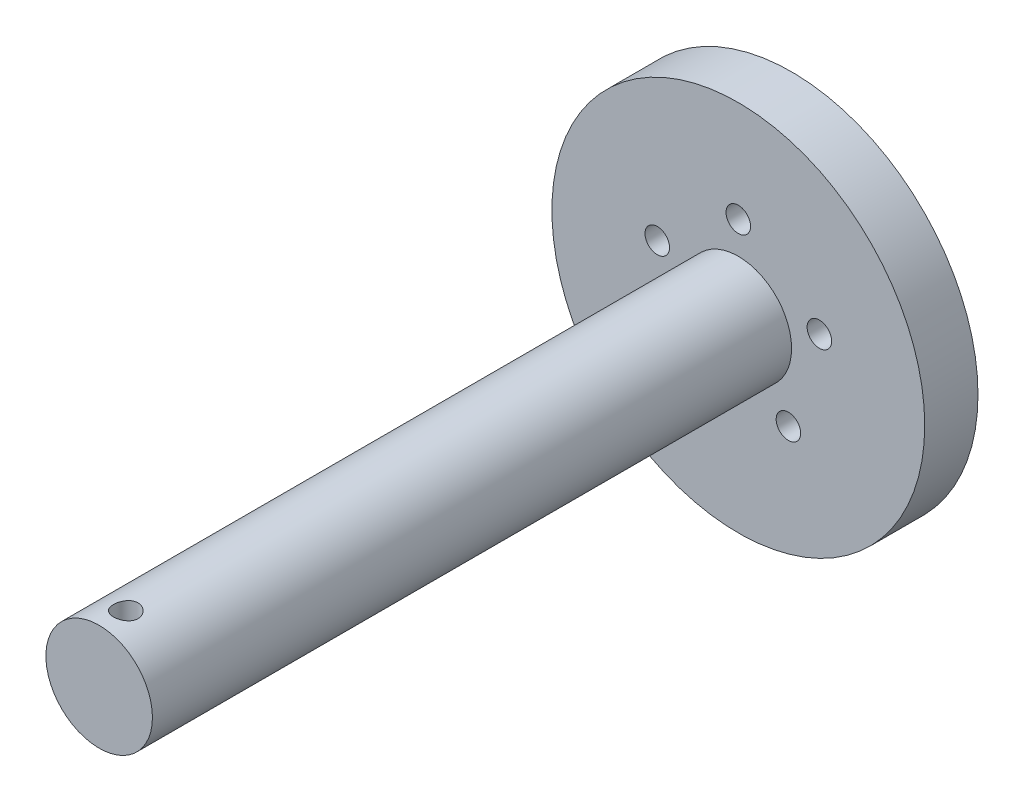
ISO-10303-21;
HEADER;
FILE_DESCRIPTION(('STEP AP214'),'2;1');
FILE_NAME('part.step','',(''),(''),'','','');
FILE_SCHEMA(('AUTOMOTIVE_DESIGN { 1 0 10303 214 1 1 1 1 }'));
ENDSEC;
DATA;
#1=APPLICATION_CONTEXT('core data for automotive mechanical design processes');
#2=APPLICATION_PROTOCOL_DEFINITION('international standard','automotive_design',2000,#1);
#3=PRODUCT_CONTEXT('',#1,'mechanical');
#4=PRODUCT('Part','Part','',(#3));
#5=PRODUCT_RELATED_PRODUCT_CATEGORY('part','',(#4));
#6=PRODUCT_DEFINITION_FORMATION('','',#4);
#7=PRODUCT_DEFINITION_CONTEXT('part definition',#1,'design');
#8=PRODUCT_DEFINITION('design','',#6,#7);
#9=PRODUCT_DEFINITION_SHAPE('','',#8);
#10=(LENGTH_UNIT() NAMED_UNIT(*) SI_UNIT(.MILLI.,.METRE.));
#11=(NAMED_UNIT(*) PLANE_ANGLE_UNIT() SI_UNIT($,.RADIAN.));
#12=(NAMED_UNIT(*) SI_UNIT($,.STERADIAN.) SOLID_ANGLE_UNIT());
#13=UNCERTAINTY_MEASURE_WITH_UNIT(LENGTH_MEASURE(1.E-05),#10,'distance_accuracy_value','');
#14=(GEOMETRIC_REPRESENTATION_CONTEXT(3) GLOBAL_UNCERTAINTY_ASSIGNED_CONTEXT((#13)) GLOBAL_UNIT_ASSIGNED_CONTEXT((#10,
#11,#12)) REPRESENTATION_CONTEXT('',''));
#15=CARTESIAN_POINT('',(0.,0.,0.));
#16=DIRECTION('',(0.,0.,1.));
#17=DIRECTION('',(1.,0.,0.));
#18=AXIS2_PLACEMENT_3D('',#15,#16,#17);
#19=CARTESIAN_POINT('',(0.,0.,12.7));
#20=DIRECTION('',(0.,0.,1.));
#21=DIRECTION('',(1.,0.,0.));
#22=AXIS2_PLACEMENT_3D('',#19,#20,#21);
#23=PLANE('',#22);
#24=CARTESIAN_POINT('',(0.,0.,12.7));
#25=DIRECTION('',(0.,0.,1.));
#26=DIRECTION('',(1.,0.,0.));
#27=AXIS2_PLACEMENT_3D('',#24,#25,#26);
#28=CIRCLE('',#27,12.7);
#29=CARTESIAN_POINT('',(12.7,0.,12.7));
#30=VERTEX_POINT('',#29);
#31=EDGE_CURVE('E92',#30,#30,#28,.T.);
#32=ORIENTED_EDGE('',*,*,#31,.F.);
#33=EDGE_LOOP('',(#32));
#34=FACE_BOUND('',#33,.T.);
#35=CARTESIAN_POINT('',(-11.9437963265832,-16.4392253256988,12.7));
#36=DIRECTION('',(0.,0.,1.));
#37=DIRECTION('',(1.,0.,0.));
#38=AXIS2_PLACEMENT_3D('',#35,#36,#37);
#39=CIRCLE('',#38,2.921);
#40=CARTESIAN_POINT('',(-9.02279632658319,-16.4392253256988,12.7));
#41=VERTEX_POINT('',#40);
#42=EDGE_CURVE('E72',#41,#41,#39,.T.);
#43=ORIENTED_EDGE('',*,*,#42,.F.);
#44=EDGE_LOOP('',(#43));
#45=FACE_BOUND('',#44,.T.);
#46=CARTESIAN_POINT('',(19.3254684111175,6.27922532569888,12.7));
#47=DIRECTION('',(0.,0.,1.));
#48=DIRECTION('',(1.,0.,0.));
#49=AXIS2_PLACEMENT_3D('',#46,#47,#48);
#50=CIRCLE('',#49,2.921);
#51=CARTESIAN_POINT('',(22.2464684111175,6.27922532569888,12.7));
#52=VERTEX_POINT('',#51);
#53=EDGE_CURVE('E56',#52,#52,#50,.T.);
#54=ORIENTED_EDGE('',*,*,#53,.F.);
#55=EDGE_LOOP('',(#54));
#56=FACE_BOUND('',#55,.T.);
#57=CARTESIAN_POINT('',(0.,0.,12.7));
#58=DIRECTION('',(0.,0.,1.));
#59=DIRECTION('',(1.,0.,0.));
#60=AXIS2_PLACEMENT_3D('',#57,#58,#59);
#61=CIRCLE('',#60,44.45);
#62=CARTESIAN_POINT('',(44.45,0.,12.7));
#63=VERTEX_POINT('',#62);
#64=EDGE_CURVE('E10',#63,#63,#61,.T.);
#65=ORIENTED_EDGE('',*,*,#64,.T.);
#66=EDGE_LOOP('',(#65));
#67=FACE_BOUND('',#66,.T.);
#68=CARTESIAN_POINT('',(0.,20.32,12.7));
#69=DIRECTION('',(0.,0.,1.));
#70=DIRECTION('',(1.,0.,0.));
#71=AXIS2_PLACEMENT_3D('',#68,#69,#70);
#72=CIRCLE('',#71,2.921);
#73=CARTESIAN_POINT('',(2.921,20.32,12.7));
#74=VERTEX_POINT('',#73);
#75=EDGE_CURVE('E50',#74,#74,#72,.T.);
#76=ORIENTED_EDGE('',*,*,#75,.F.);
#77=EDGE_LOOP('',(#76));
#78=FACE_BOUND('',#77,.T.);
#79=CARTESIAN_POINT('',(11.943796326583,-16.439225325699,12.7));
#80=DIRECTION('',(0.,0.,1.));
#81=DIRECTION('',(1.,0.,0.));
#82=AXIS2_PLACEMENT_3D('',#79,#80,#81);
#83=CIRCLE('',#82,2.921);
#84=CARTESIAN_POINT('',(14.864796326583,-16.439225325699,12.7));
#85=VERTEX_POINT('',#84);
#86=EDGE_CURVE('E64',#85,#85,#83,.T.);
#87=ORIENTED_EDGE('',*,*,#86,.F.);
#88=EDGE_LOOP('',(#87));
#89=FACE_BOUND('',#88,.T.);
#90=CARTESIAN_POINT('',(-19.3254684111175,6.27922532569915,12.7));
#91=DIRECTION('',(0.,0.,1.));
#92=DIRECTION('',(1.,0.,0.));
#93=AXIS2_PLACEMENT_3D('',#90,#91,#92);
#94=CIRCLE('',#93,2.921);
#95=CARTESIAN_POINT('',(-16.4044684111175,6.27922532569915,12.7));
#96=VERTEX_POINT('',#95);
#97=EDGE_CURVE('E80',#96,#96,#94,.T.);
#98=ORIENTED_EDGE('',*,*,#97,.F.);
#99=EDGE_LOOP('',(#98));
#100=FACE_BOUND('',#99,.T.);
#101=ADVANCED_FACE('F37',(#34,#45,#56,#67,#78,#89,#100),#23,.T.);
#102=CARTESIAN_POINT('',(0.,0.,0.));
#103=DIRECTION('',(0.,0.,1.));
#104=DIRECTION('',(1.,0.,0.));
#105=AXIS2_PLACEMENT_3D('',#102,#103,#104);
#106=PLANE('',#105);
#107=CARTESIAN_POINT('',(0.,0.,0.));
#108=DIRECTION('',(0.,0.,1.));
#109=DIRECTION('',(1.,0.,0.));
#110=AXIS2_PLACEMENT_3D('',#107,#108,#109);
#111=CIRCLE('',#110,44.45);
#112=CARTESIAN_POINT('',(44.45,0.,0.));
#113=VERTEX_POINT('',#112);
#114=EDGE_CURVE('E41',#113,#113,#111,.T.);
#115=ORIENTED_EDGE('',*,*,#114,.F.);
#116=EDGE_LOOP('',(#115));
#117=FACE_BOUND('',#116,.T.);
#118=CARTESIAN_POINT('',(0.,20.32,0.));
#119=DIRECTION('',(0.,0.,1.));
#120=DIRECTION('',(1.,0.,0.));
#121=AXIS2_PLACEMENT_3D('',#118,#119,#120);
#122=CIRCLE('',#121,2.921);
#123=CARTESIAN_POINT('',(2.921,20.32,0.));
#124=VERTEX_POINT('',#123);
#125=EDGE_CURVE('E52',#124,#124,#122,.T.);
#126=ORIENTED_EDGE('',*,*,#125,.T.);
#127=EDGE_LOOP('',(#126));
#128=FACE_BOUND('',#127,.T.);
#129=CARTESIAN_POINT('',(19.3254684111175,6.27922532569888,0.));
#130=DIRECTION('',(0.,0.,1.));
#131=DIRECTION('',(1.,0.,0.));
#132=AXIS2_PLACEMENT_3D('',#129,#130,#131);
#133=CIRCLE('',#132,2.921);
#134=CARTESIAN_POINT('',(22.2464684111175,6.27922532569888,0.));
#135=VERTEX_POINT('',#134);
#136=EDGE_CURVE('E60',#135,#135,#133,.T.);
#137=ORIENTED_EDGE('',*,*,#136,.T.);
#138=EDGE_LOOP('',(#137));
#139=FACE_BOUND('',#138,.T.);
#140=CARTESIAN_POINT('',(11.943796326583,-16.439225325699,0.));
#141=DIRECTION('',(0.,0.,1.));
#142=DIRECTION('',(1.,0.,0.));
#143=AXIS2_PLACEMENT_3D('',#140,#141,#142);
#144=CIRCLE('',#143,2.921);
#145=CARTESIAN_POINT('',(14.864796326583,-16.439225325699,0.));
#146=VERTEX_POINT('',#145);
#147=EDGE_CURVE('E68',#146,#146,#144,.T.);
#148=ORIENTED_EDGE('',*,*,#147,.T.);
#149=EDGE_LOOP('',(#148));
#150=FACE_BOUND('',#149,.T.);
#151=CARTESIAN_POINT('',(-11.9437963265832,-16.4392253256988,0.));
#152=DIRECTION('',(0.,0.,1.));
#153=DIRECTION('',(1.,0.,0.));
#154=AXIS2_PLACEMENT_3D('',#151,#152,#153);
#155=CIRCLE('',#154,2.921);
#156=CARTESIAN_POINT('',(-9.02279632658319,-16.4392253256988,0.));
#157=VERTEX_POINT('',#156);
#158=EDGE_CURVE('E76',#157,#157,#155,.T.);
#159=ORIENTED_EDGE('',*,*,#158,.T.);
#160=EDGE_LOOP('',(#159));
#161=FACE_BOUND('',#160,.T.);
#162=CARTESIAN_POINT('',(-19.3254684111175,6.27922532569915,0.));
#163=DIRECTION('',(0.,0.,1.));
#164=DIRECTION('',(1.,0.,0.));
#165=AXIS2_PLACEMENT_3D('',#162,#163,#164);
#166=CIRCLE('',#165,2.921);
#167=CARTESIAN_POINT('',(-16.4044684111175,6.27922532569915,0.));
#168=VERTEX_POINT('',#167);
#169=EDGE_CURVE('E84',#168,#168,#166,.T.);
#170=ORIENTED_EDGE('',*,*,#169,.T.);
#171=EDGE_LOOP('',(#170));
#172=FACE_BOUND('',#171,.T.);
#173=ADVANCED_FACE('F149',(#117,#128,#139,#150,#161,#172),#106,.F.);
#174=CARTESIAN_POINT('',(0.,0.,12.7));
#175=DIRECTION('',(0.,0.,-1.));
#176=DIRECTION('',(-1.,0.,0.));
#177=AXIS2_PLACEMENT_3D('',#174,#175,#176);
#178=CYLINDRICAL_SURFACE('',#177,44.45);
#179=ORIENTED_EDGE('',*,*,#64,.F.);
#180=EDGE_LOOP('',(#179));
#181=FACE_BOUND('',#180,.T.);
#182=ORIENTED_EDGE('',*,*,#114,.T.);
#183=EDGE_LOOP('',(#182));
#184=FACE_BOUND('',#183,.T.);
#185=ADVANCED_FACE('F39',(#181,#184),#178,.T.);
#186=CARTESIAN_POINT('',(0.,20.32,12.7));
#187=DIRECTION('',(0.,0.,-1.));
#188=DIRECTION('',(-1.,0.,0.));
#189=AXIS2_PLACEMENT_3D('',#186,#187,#188);
#190=CYLINDRICAL_SURFACE('',#189,2.921);
#191=ORIENTED_EDGE('',*,*,#75,.T.);
#192=EDGE_LOOP('',(#191));
#193=FACE_BOUND('',#192,.T.);
#194=ORIENTED_EDGE('',*,*,#125,.F.);
#195=EDGE_LOOP('',(#194));
#196=FACE_BOUND('',#195,.T.);
#197=ADVANCED_FACE('F143',(#193,#196),#190,.F.);
#198=CARTESIAN_POINT('',(19.3254684111175,6.27922532569888,12.7));
#199=DIRECTION('',(0.,0.,-1.));
#200=DIRECTION('',(-1.,0.,0.));
#201=AXIS2_PLACEMENT_3D('',#198,#199,#200);
#202=CYLINDRICAL_SURFACE('',#201,2.921);
#203=ORIENTED_EDGE('',*,*,#53,.T.);
#204=EDGE_LOOP('',(#203));
#205=FACE_BOUND('',#204,.T.);
#206=ORIENTED_EDGE('',*,*,#136,.F.);
#207=EDGE_LOOP('',(#206));
#208=FACE_BOUND('',#207,.T.);
#209=ADVANCED_FACE('F139',(#205,#208),#202,.F.);
#210=CARTESIAN_POINT('',(11.943796326583,-16.439225325699,12.7));
#211=DIRECTION('',(0.,0.,-1.));
#212=DIRECTION('',(-1.,0.,0.));
#213=AXIS2_PLACEMENT_3D('',#210,#211,#212);
#214=CYLINDRICAL_SURFACE('',#213,2.921);
#215=ORIENTED_EDGE('',*,*,#86,.T.);
#216=EDGE_LOOP('',(#215));
#217=FACE_BOUND('',#216,.T.);
#218=ORIENTED_EDGE('',*,*,#147,.F.);
#219=EDGE_LOOP('',(#218));
#220=FACE_BOUND('',#219,.T.);
#221=ADVANCED_FACE('F135',(#217,#220),#214,.F.);
#222=CARTESIAN_POINT('',(-11.9437963265832,-16.4392253256988,12.7));
#223=DIRECTION('',(0.,0.,-1.));
#224=DIRECTION('',(-1.,0.,0.));
#225=AXIS2_PLACEMENT_3D('',#222,#223,#224);
#226=CYLINDRICAL_SURFACE('',#225,2.921);
#227=ORIENTED_EDGE('',*,*,#42,.T.);
#228=EDGE_LOOP('',(#227));
#229=FACE_BOUND('',#228,.T.);
#230=ORIENTED_EDGE('',*,*,#158,.F.);
#231=EDGE_LOOP('',(#230));
#232=FACE_BOUND('',#231,.T.);
#233=ADVANCED_FACE('F131',(#229,#232),#226,.F.);
#234=CARTESIAN_POINT('',(-19.3254684111175,6.27922532569915,12.7));
#235=DIRECTION('',(0.,0.,-1.));
#236=DIRECTION('',(-1.,0.,0.));
#237=AXIS2_PLACEMENT_3D('',#234,#235,#236);
#238=CYLINDRICAL_SURFACE('',#237,2.921);
#239=ORIENTED_EDGE('',*,*,#97,.T.);
#240=EDGE_LOOP('',(#239));
#241=FACE_BOUND('',#240,.T.);
#242=ORIENTED_EDGE('',*,*,#169,.F.);
#243=EDGE_LOOP('',(#242));
#244=FACE_BOUND('',#243,.T.);
#245=ADVANCED_FACE('F127',(#241,#244),#238,.F.);
#246=CARTESIAN_POINT('',(0.,0.,165.1));
#247=DIRECTION('',(0.,0.,-1.));
#248=DIRECTION('',(-1.,0.,0.));
#249=AXIS2_PLACEMENT_3D('',#246,#247,#248);
#250=CYLINDRICAL_SURFACE('',#249,12.7);
#251=CARTESIAN_POINT('',(0.,12.7,155.829));
#252=CARTESIAN_POINT('',(-0.161791988365735,12.6999970647349,155.829005213744));
#253=CARTESIAN_POINT('',(-0.323645239309982,12.6968770614982,155.842487643187));
#254=CARTESIAN_POINT('',(-0.642739986536925,12.6847324159928,155.895996615792));
#255=CARTESIAN_POINT('',(-0.79997835148879,12.6757038571514,155.936040766019));
#256=CARTESIAN_POINT('',(-1.10518689570164,12.652745471281,156.041341248176));
#257=CARTESIAN_POINT('',(-1.25316705672757,12.6388210338969,156.106569863414));
#258=CARTESIAN_POINT('',(-1.5360803658525,12.6075668031072,156.260296316434));
#259=CARTESIAN_POINT('',(-1.67101357676365,12.5902370260972,156.348794042183));
#260=CARTESIAN_POINT('',(-1.92638521991923,12.5537230179431,156.54819690832));
#261=CARTESIAN_POINT('',(-2.0465607059451,12.5345137956361,156.659434248321));
#262=CARTESIAN_POINT('',(-2.26672366205061,12.4965784293557,156.900446215234));
#263=CARTESIAN_POINT('',(-2.36670917577204,12.4778523323493,157.030222636458));
#264=CARTESIAN_POINT('',(-2.54484046143641,12.4427552467236,157.306606790747));
#265=CARTESIAN_POINT('',(-2.62270139498789,12.4264161844912,157.453402522439));
#266=CARTESIAN_POINT('',(-2.75254466561769,12.3983039513594,157.758433630615));
#267=CARTESIAN_POINT('',(-2.8045304514541,12.3865301720245,157.916667479354));
#268=CARTESIAN_POINT('',(-2.88026898262258,12.3691369635251,158.23721680994));
#269=CARTESIAN_POINT('',(-2.90448985025934,12.3634156206721,158.3994160334));
#270=CARTESIAN_POINT('',(-2.92546749520377,12.3584693670794,158.72566884009));
#271=CARTESIAN_POINT('',(-2.92222802034675,12.3592435698163,158.889722167217));
#272=CARTESIAN_POINT('',(-2.88875253307512,12.3671088866499,159.211509627339));
#273=CARTESIAN_POINT('',(-2.85906508317054,12.3740716361207,159.369304445191));
#274=CARTESIAN_POINT('',(-2.77440752094658,12.3933260161791,159.677611977654));
#275=CARTESIAN_POINT('',(-2.71943585654971,12.4056179738986,159.828124244598));
#276=CARTESIAN_POINT('',(-2.58527929519974,12.4342692457019,160.119111573749));
#277=CARTESIAN_POINT('',(-2.50588759799799,12.4506630660977,160.259487753486));
#278=CARTESIAN_POINT('',(-2.32528973017409,12.4856503267689,160.525126322198));
#279=CARTESIAN_POINT('',(-2.22408029046687,12.5042440964873,160.65038644185));
#280=CARTESIAN_POINT('',(-1.99983760019352,12.5420834491417,160.885390591578));
#281=CARTESIAN_POINT('',(-1.87633907073828,12.5613339683604,160.99469033427));
#282=CARTESIAN_POINT('',(-1.61254226059999,12.5979129810336,161.191104268127));
#283=CARTESIAN_POINT('',(-1.47224360995677,12.6152414321455,161.278217970594));
#284=CARTESIAN_POINT('',(-1.17825525523572,12.6460898028565,161.427914942753));
#285=CARTESIAN_POINT('',(-1.02453236430193,12.6595999127898,161.49043518803));
#286=CARTESIAN_POINT('',(-0.708381581725828,12.6812171472574,161.588630437952));
#287=CARTESIAN_POINT('',(-0.545955097640875,12.6893251425971,161.624309769396));
#288=CARTESIAN_POINT('',(-0.220814435132276,12.6990989390001,161.667153041478));
#289=CARTESIAN_POINT('',(-0.0581841440404604,12.7009016765217,161.674923210548));
#290=CARTESIAN_POINT('',(0.266051162109863,12.6982477443443,161.663377509984));
#291=CARTESIAN_POINT('',(0.427656253562988,12.693791546678,161.644063682957));
#292=CARTESIAN_POINT('',(0.743211224842891,12.679207342039,161.57940005274));
#293=CARTESIAN_POINT('',(0.897230707331532,12.6691496042788,161.534372642662));
#294=CARTESIAN_POINT('',(1.19552825469156,12.644490195932,161.41992143889));
#295=CARTESIAN_POINT('',(1.33980543038585,12.6298881112647,161.350495421921));
#296=CARTESIAN_POINT('',(1.61699707115781,12.5974249490779,161.187985413114));
#297=CARTESIAN_POINT('',(1.74970046025282,12.5795168136959,161.094551006639));
#298=CARTESIAN_POINT('',(1.99776154113809,12.5425159177875,160.887133113221));
#299=CARTESIAN_POINT('',(2.11311672034808,12.5234229862289,160.773146654925));
#300=CARTESIAN_POINT('',(2.32563938819834,12.4857243417873,160.525065950726));
#301=CARTESIAN_POINT('',(2.42238502798991,12.4671366696917,160.390607045736));
#302=CARTESIAN_POINT('',(2.59192805334683,12.4329971520183,160.106996717731));
#303=CARTESIAN_POINT('',(2.66472650260241,12.4174451716131,159.957845947683));
#304=CARTESIAN_POINT('',(2.78379411562039,12.3912956852758,159.649898837761));
#305=CARTESIAN_POINT('',(2.83021721439997,12.3806694992805,159.491164574849));
#306=CARTESIAN_POINT('',(2.89565432154699,12.3655301108863,159.167869142347));
#307=CARTESIAN_POINT('',(2.91467325391904,12.3610158103073,159.003309024998));
#308=CARTESIAN_POINT('',(2.92453562219783,12.3586856440773,158.677299344076));
#309=CARTESIAN_POINT('',(2.91604962163952,12.3607103545853,158.515870852228));
#310=CARTESIAN_POINT('',(2.87265442488283,12.3708667391052,158.19681125656));
#311=CARTESIAN_POINT('',(2.83774561091784,12.3789983247748,158.039180097843));
#312=CARTESIAN_POINT('',(2.7428348616303,12.4003705499824,157.732790387718));
#313=CARTESIAN_POINT('',(2.6829403091439,12.4135893074383,157.58399694334));
#314=CARTESIAN_POINT('',(2.53984711468253,12.4436529279168,157.298474541572));
#315=CARTESIAN_POINT('',(2.45664575526635,12.4604982137189,157.161746993443));
#316=CARTESIAN_POINT('',(2.26711897554109,12.4963856088391,156.900954163352));
#317=CARTESIAN_POINT('',(2.16031993796052,12.5154682801239,156.777238592019));
#318=CARTESIAN_POINT('',(1.92757677814579,12.553418819743,156.549265937754));
#319=CARTESIAN_POINT('',(1.80162820464565,12.572286637036,156.445013391542));
#320=CARTESIAN_POINT('',(1.53193099702332,12.6080109458739,156.257450490243));
#321=CARTESIAN_POINT('',(1.38794819360234,12.624833843891,156.174470044477));
#322=CARTESIAN_POINT('',(1.0877145565923,12.6542304997702,156.034021852378));
#323=CARTESIAN_POINT('',(0.931473620756516,12.666807643198,155.976533766904));
#324=CARTESIAN_POINT('',(0.646013875560823,12.6841827727736,155.898363698891));
#325=CARTESIAN_POINT('',(0.518280603611839,12.69007614118,155.872404146052));
#326=CARTESIAN_POINT('',(0.26037802657059,12.6979858316875,155.837720662041));
#327=CARTESIAN_POINT('',(0.130208852856308,12.700002362277,155.828995804022));
#328=CARTESIAN_POINT('',(0.,12.7,155.829));
#329=B_SPLINE_CURVE_WITH_KNOTS('',3,(#251,#252,#253,#254,#255,#256,#257,#258,#259,#260,#261,
#262,#263,#264,#265,#266,#267,#268,#269,#270,#271,#272,#273,#274,#275,#276,#277,#278,#279,#280,
#281,#282,#283,#284,#285,#286,#287,#288,#289,#290,#291,#292,#293,#294,#295,#296,#297,#298,#299,
#300,#301,#302,#303,#304,#305,#306,#307,#308,#309,#310,#311,#312,#313,#314,#315,#316,#317,#318,
#319,#320,#321,#322,#323,#324,#325,#326,#327,#328),.UNSPECIFIED.,.T.,.F.,(4,2,2,2,2,2,2,2,2,2,2,
2,2,2,2,2,2,2,2,2,2,2,2,2,2,2,2,2,2,2,2,2,2,2,2,2,2,2,4),(0.,0.484899162894529,
0.970120074326082,1.45480849247281,1.93949457705973,2.43184500537261,2.92424311835149,
3.42271966492526,3.92112975446096,4.41100688626892,4.90081715987016,5.38069876831246,
5.86060983833309,6.34470244785137,6.82886764238891,7.32464721045124,7.82043769822319,
8.31749057284788,8.81446330456853,9.30057347160131,9.78664697942678,10.2667559265233,
10.7469086339406,11.2345125418666,11.7221870026933,12.2198699218079,12.7175307317752,
13.2122563831141,13.706893130625,14.1895623045773,14.6722244963531,15.1528333486866,
15.6334982606208,16.1248653125685,16.6163467567817,17.1150433796172,17.6133413970775,
18.0036052173584,18.3938480494617),.UNSPECIFIED.);
#330=CARTESIAN_POINT('',(0.,12.7,155.829));
#331=VERTEX_POINT('',#330);
#332=EDGE_CURVE('E96',#331,#331,#329,.T.);
#333=ORIENTED_EDGE('',*,*,#332,.F.);
#334=EDGE_LOOP('',(#333));
#335=FACE_BOUND('',#334,.T.);
#336=CARTESIAN_POINT('',(0.,-12.7,155.829));
#337=CARTESIAN_POINT('',(0.161791988365735,-12.6999970647349,155.829005213744));
#338=CARTESIAN_POINT('',(0.323645239309982,-12.6968770614982,155.842487643187));
#339=CARTESIAN_POINT('',(0.642739986536925,-12.6847324159928,155.895996615792));
#340=CARTESIAN_POINT('',(0.799978351488789,-12.6757038571514,155.936040766019));
#341=CARTESIAN_POINT('',(1.10518689570165,-12.652745471281,156.041341248176));
#342=CARTESIAN_POINT('',(1.25316705672758,-12.6388210338969,156.106569863414));
#343=CARTESIAN_POINT('',(1.5360803658525,-12.6075668031072,156.260296316434));
#344=CARTESIAN_POINT('',(1.67101357676365,-12.5902370260972,156.348794042183));
#345=CARTESIAN_POINT('',(1.92638521991923,-12.5537230179431,156.54819690832));
#346=CARTESIAN_POINT('',(2.0465607059451,-12.5345137956361,156.659434248321));
#347=CARTESIAN_POINT('',(2.26672366205061,-12.4965784293557,156.900446215234));
#348=CARTESIAN_POINT('',(2.36670917577204,-12.4778523323493,157.030222636458));
#349=CARTESIAN_POINT('',(2.54484046143641,-12.4427552467236,157.306606790747));
#350=CARTESIAN_POINT('',(2.62270139498789,-12.4264161844912,157.453402522439));
#351=CARTESIAN_POINT('',(2.75254466561769,-12.3983039513594,157.758433630615));
#352=CARTESIAN_POINT('',(2.8045304514541,-12.3865301720245,157.916667479354));
#353=CARTESIAN_POINT('',(2.88026898262258,-12.3691369635251,158.23721680994));
#354=CARTESIAN_POINT('',(2.90448985025934,-12.3634156206721,158.3994160334));
#355=CARTESIAN_POINT('',(2.92546749520377,-12.3584693670794,158.72566884009));
#356=CARTESIAN_POINT('',(2.92222802034675,-12.3592435698163,158.889722167217));
#357=CARTESIAN_POINT('',(2.88875253307512,-12.3671088866499,159.211509627339));
#358=CARTESIAN_POINT('',(2.85906508317054,-12.3740716361207,159.369304445191));
#359=CARTESIAN_POINT('',(2.77440752094658,-12.3933260161791,159.677611977654));
#360=CARTESIAN_POINT('',(2.71943585654971,-12.4056179738986,159.828124244598));
#361=CARTESIAN_POINT('',(2.58527929519974,-12.4342692457019,160.119111573749));
#362=CARTESIAN_POINT('',(2.50588759799799,-12.4506630660977,160.259487753486));
#363=CARTESIAN_POINT('',(2.32528973017409,-12.4856503267689,160.525126322198));
#364=CARTESIAN_POINT('',(2.22408029046687,-12.5042440964873,160.65038644185));
#365=CARTESIAN_POINT('',(1.99983760019352,-12.5420834491417,160.885390591578));
#366=CARTESIAN_POINT('',(1.87633907073828,-12.5613339683604,160.99469033427));
#367=CARTESIAN_POINT('',(1.61254226059999,-12.5979129810336,161.191104268127));
#368=CARTESIAN_POINT('',(1.47224360995677,-12.6152414321455,161.278217970594));
#369=CARTESIAN_POINT('',(1.17825525523572,-12.6460898028565,161.427914942753));
#370=CARTESIAN_POINT('',(1.02453236430193,-12.6595999127898,161.49043518803));
#371=CARTESIAN_POINT('',(0.708381581725828,-12.6812171472574,161.588630437952));
#372=CARTESIAN_POINT('',(0.545955097640875,-12.6893251425971,161.624309769396));
#373=CARTESIAN_POINT('',(0.220814435132276,-12.6990989390001,161.667153041478));
#374=CARTESIAN_POINT('',(0.0581841440404604,-12.7009016765217,161.674923210548));
#375=CARTESIAN_POINT('',(-0.266051162109863,-12.6982477443443,161.663377509984));
#376=CARTESIAN_POINT('',(-0.427656253562988,-12.693791546678,161.644063682957));
#377=CARTESIAN_POINT('',(-0.743211224842891,-12.679207342039,161.57940005274));
#378=CARTESIAN_POINT('',(-0.897230707331532,-12.6691496042788,161.534372642662));
#379=CARTESIAN_POINT('',(-1.19552825469156,-12.644490195932,161.41992143889));
#380=CARTESIAN_POINT('',(-1.33980543038585,-12.6298881112647,161.350495421921));
#381=CARTESIAN_POINT('',(-1.61699707115781,-12.5974249490779,161.187985413114));
#382=CARTESIAN_POINT('',(-1.74970046025282,-12.5795168136959,161.094551006639));
#383=CARTESIAN_POINT('',(-1.99776154113809,-12.5425159177875,160.887133113221));
#384=CARTESIAN_POINT('',(-2.11311672034808,-12.5234229862289,160.773146654925));
#385=CARTESIAN_POINT('',(-2.32563938819834,-12.4857243417873,160.525065950726));
#386=CARTESIAN_POINT('',(-2.42238502798991,-12.4671366696917,160.390607045736));
#387=CARTESIAN_POINT('',(-2.59192805334683,-12.4329971520183,160.106996717731));
#388=CARTESIAN_POINT('',(-2.66472650260241,-12.4174451716131,159.957845947683));
#389=CARTESIAN_POINT('',(-2.78379411562039,-12.3912956852758,159.649898837761));
#390=CARTESIAN_POINT('',(-2.83021721439997,-12.3806694992805,159.491164574849));
#391=CARTESIAN_POINT('',(-2.89565432154699,-12.3655301108863,159.167869142347));
#392=CARTESIAN_POINT('',(-2.91467325391904,-12.3610158103073,159.003309024998));
#393=CARTESIAN_POINT('',(-2.92453562219783,-12.3586856440773,158.677299344076));
#394=CARTESIAN_POINT('',(-2.91604962163952,-12.3607103545853,158.515870852228));
#395=CARTESIAN_POINT('',(-2.87265442488283,-12.3708667391052,158.19681125656));
#396=CARTESIAN_POINT('',(-2.83774561091784,-12.3789983247748,158.039180097843));
#397=CARTESIAN_POINT('',(-2.7428348616303,-12.4003705499824,157.732790387718));
#398=CARTESIAN_POINT('',(-2.6829403091439,-12.4135893074383,157.58399694334));
#399=CARTESIAN_POINT('',(-2.53984711468253,-12.4436529279168,157.298474541572));
#400=CARTESIAN_POINT('',(-2.45664575526635,-12.4604982137189,157.161746993443));
#401=CARTESIAN_POINT('',(-2.26711897554109,-12.4963856088391,156.900954163352));
#402=CARTESIAN_POINT('',(-2.16031993796052,-12.5154682801239,156.777238592019));
#403=CARTESIAN_POINT('',(-1.92757677814579,-12.553418819743,156.549265937754));
#404=CARTESIAN_POINT('',(-1.80162820464565,-12.572286637036,156.445013391542));
#405=CARTESIAN_POINT('',(-1.53193099702332,-12.6080109458739,156.257450490243));
#406=CARTESIAN_POINT('',(-1.38794819360234,-12.624833843891,156.174470044477));
#407=CARTESIAN_POINT('',(-1.0877145565923,-12.6542304997702,156.034021852378));
#408=CARTESIAN_POINT('',(-0.931473620756516,-12.666807643198,155.976533766904));
#409=CARTESIAN_POINT('',(-0.646013875560823,-12.6841827727736,155.898363698891));
#410=CARTESIAN_POINT('',(-0.518280603611839,-12.69007614118,155.872404146052));
#411=CARTESIAN_POINT('',(-0.26037802657059,-12.6979858316875,155.837720662041));
#412=CARTESIAN_POINT('',(-0.130208852856308,-12.700002362277,155.828995804022));
#413=CARTESIAN_POINT('',(0.,-12.7,155.829));
#414=B_SPLINE_CURVE_WITH_KNOTS('',3,(#336,#337,#338,#339,#340,#341,#342,#343,#344,#345,#346,
#347,#348,#349,#350,#351,#352,#353,#354,#355,#356,#357,#358,#359,#360,#361,#362,#363,#364,#365,
#366,#367,#368,#369,#370,#371,#372,#373,#374,#375,#376,#377,#378,#379,#380,#381,#382,#383,#384,
#385,#386,#387,#388,#389,#390,#391,#392,#393,#394,#395,#396,#397,#398,#399,#400,#401,#402,#403,
#404,#405,#406,#407,#408,#409,#410,#411,#412,#413),.UNSPECIFIED.,.T.,.F.,(4,2,2,2,2,2,2,2,2,2,2,
2,2,2,2,2,2,2,2,2,2,2,2,2,2,2,2,2,2,2,2,2,2,2,2,2,2,2,4),(0.,0.484899162894528,
0.970120074326082,1.45480849247282,1.93949457705973,2.43184500537261,2.92424311835149,
3.42271966492526,3.92112975446096,4.41100688626892,4.90081715987017,5.38069876831246,
5.86060983833309,6.34470244785137,6.82886764238891,7.32464721045124,7.82043769822319,
8.31749057284788,8.81446330456853,9.30057347160131,9.78664697942678,10.2667559265233,
10.7469086339406,11.2345125418666,11.7221870026933,12.2198699218079,12.7175307317752,
13.2122563831141,13.706893130625,14.1895623045773,14.6722244963531,15.1528333486866,
15.6334982606208,16.1248653125685,16.6163467567817,17.1150433796172,17.6133413970775,
18.0036052173584,18.3938480494617),.UNSPECIFIED.);
#415=CARTESIAN_POINT('',(0.,-12.7,155.829));
#416=VERTEX_POINT('',#415);
#417=EDGE_CURVE('E108',#416,#416,#414,.T.);
#418=ORIENTED_EDGE('',*,*,#417,.F.);
#419=EDGE_LOOP('',(#418));
#420=FACE_BOUND('',#419,.T.);
#421=CARTESIAN_POINT('',(0.,0.,165.1));
#422=DIRECTION('',(0.,0.,1.));
#423=DIRECTION('',(1.,0.,0.));
#424=AXIS2_PLACEMENT_3D('',#421,#422,#423);
#425=CIRCLE('',#424,12.7);
#426=CARTESIAN_POINT('',(12.7,0.,165.1));
#427=VERTEX_POINT('',#426);
#428=EDGE_CURVE('E88',#427,#427,#425,.T.);
#429=ORIENTED_EDGE('',*,*,#428,.F.);
#430=EDGE_LOOP('',(#429));
#431=FACE_BOUND('',#430,.T.);
#432=ORIENTED_EDGE('',*,*,#31,.T.);
#433=EDGE_LOOP('',(#432));
#434=FACE_BOUND('',#433,.T.);
#435=ADVANCED_FACE('F123',(#335,#420,#431,#434),#250,.T.);
#436=CARTESIAN_POINT('',(0.,0.,165.1));
#437=DIRECTION('',(0.,0.,1.));
#438=DIRECTION('',(1.,0.,0.));
#439=AXIS2_PLACEMENT_3D('',#436,#437,#438);
#440=PLANE('',#439);
#441=ORIENTED_EDGE('',*,*,#428,.T.);
#442=EDGE_LOOP('',(#441));
#443=FACE_BOUND('',#442,.T.);
#444=ADVANCED_FACE('F118',(#443),#440,.T.);
#445=CARTESIAN_POINT('',(0.,44.451,158.75));
#446=DIRECTION('',(0.,-1.,0.));
#447=DIRECTION('',(0.,0.,-1.));
#448=AXIS2_PLACEMENT_3D('',#445,#446,#447);
#449=CYLINDRICAL_SURFACE('',#448,2.921);
#450=ORIENTED_EDGE('',*,*,#332,.T.);
#451=EDGE_LOOP('',(#450));
#452=FACE_BOUND('',#451,.T.);
#453=ORIENTED_EDGE('',*,*,#417,.T.);
#454=EDGE_LOOP('',(#453));
#455=FACE_BOUND('',#454,.T.);
#456=ADVANCED_FACE('F112',(#452,#455),#449,.F.);
#457=CLOSED_SHELL('',(#101,#173,#185,#197,#209,#221,#233,#245,#435,#444,#456));
#458=MANIFOLD_SOLID_BREP('B2',#457);
#459=ADVANCED_BREP_SHAPE_REPRESENTATION('',(#18,#458),#14);
#460=SHAPE_DEFINITION_REPRESENTATION(#9,#459);
ENDSEC;
END-ISO-10303-21;
